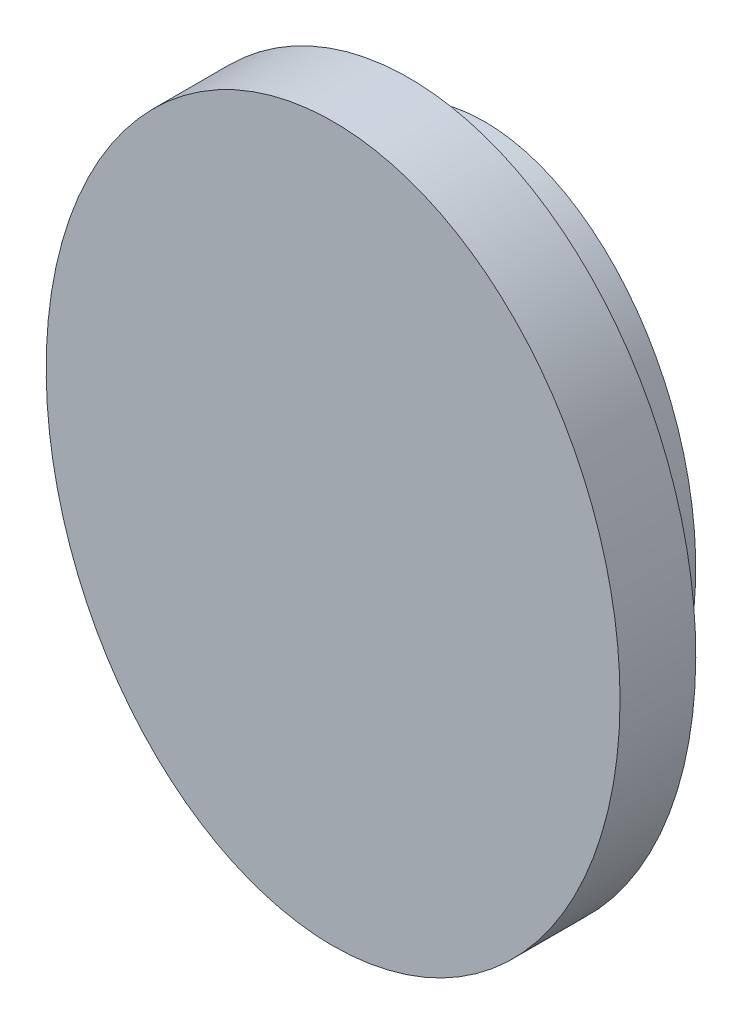
ISO-10303-21;
HEADER;
FILE_DESCRIPTION(('STEP AP214'),'2;1');
FILE_NAME('part.step','',(''),(''),'','','');
FILE_SCHEMA(('AUTOMOTIVE_DESIGN { 1 0 10303 214 1 1 1 1 }'));
ENDSEC;
DATA;
#1=APPLICATION_CONTEXT('core data for automotive mechanical design processes');
#2=APPLICATION_PROTOCOL_DEFINITION('international standard','automotive_design',2000,#1);
#3=PRODUCT_CONTEXT('',#1,'mechanical');
#4=PRODUCT('Part','Part','',(#3));
#5=PRODUCT_RELATED_PRODUCT_CATEGORY('part','',(#4));
#6=PRODUCT_DEFINITION_FORMATION('','',#4);
#7=PRODUCT_DEFINITION_CONTEXT('part definition',#1,'design');
#8=PRODUCT_DEFINITION('design','',#6,#7);
#9=PRODUCT_DEFINITION_SHAPE('','',#8);
#10=(LENGTH_UNIT() NAMED_UNIT(*) SI_UNIT(.MILLI.,.METRE.));
#11=(NAMED_UNIT(*) PLANE_ANGLE_UNIT() SI_UNIT($,.RADIAN.));
#12=(NAMED_UNIT(*) SI_UNIT($,.STERADIAN.) SOLID_ANGLE_UNIT());
#13=UNCERTAINTY_MEASURE_WITH_UNIT(LENGTH_MEASURE(1.E-05),#10,'distance_accuracy_value','');
#14=(GEOMETRIC_REPRESENTATION_CONTEXT(3) GLOBAL_UNCERTAINTY_ASSIGNED_CONTEXT((#13)) GLOBAL_UNIT_ASSIGNED_CONTEXT((#10,
#11,#12)) REPRESENTATION_CONTEXT('',''));
#15=CARTESIAN_POINT('',(0.,0.,0.));
#16=DIRECTION('',(0.,0.,1.));
#17=DIRECTION('',(1.,0.,0.));
#18=AXIS2_PLACEMENT_3D('',#15,#16,#17);
#19=CARTESIAN_POINT('',(1.27,19.4950122346036,-2.54));
#20=CARTESIAN_POINT('',(0.720238367655311,19.4950122346036,-2.54));
#21=CARTESIAN_POINT('',(0.185844426849238,19.408896345784,-2.54));
#22=CARTESIAN_POINT('',(-0.594767976275038,19.1621653072128,-2.54));
#23=CARTESIAN_POINT('',(-0.850648642388675,19.0600105914774,-2.54));
#24=CARTESIAN_POINT('',(-1.34069749980386,18.8247719338621,-2.54));
#25=CARTESIAN_POINT('',(-1.57692884048701,18.6910895864911,-2.54));
#26=CARTESIAN_POINT('',(-2.03324426196175,18.3942274348076,-2.54));
#27=CARTESIAN_POINT('',(-2.25438780143902,18.2299977459865,-2.54));
#28=CARTESIAN_POINT('',(-2.67235496508591,17.8813303880638,-2.54));
#29=CARTESIAN_POINT('',(-2.87014605876249,17.6964670955643,-2.54));
#30=CARTESIAN_POINT('',(-3.24571809162454,17.3079154565766,-2.54));
#31=CARTESIAN_POINT('',(-3.42348656390803,17.1042153815382,-2.54));
#32=CARTESIAN_POINT('',(-3.76041237937625,16.6793063456489,-2.54));
#33=CARTESIAN_POINT('',(-3.92018765386186,16.4571078268279,-2.54));
#34=CARTESIAN_POINT('',(-4.36804480913618,15.7725731833806,-2.54));
#35=CARTESIAN_POINT('',(-4.62308173466788,15.2964008729848,-2.54));
#36=CARTESIAN_POINT('',(-5.05894862807008,14.3102789975543,-2.54));
#37=CARTESIAN_POINT('',(-5.23962424472151,13.8002591754899,-2.54));
#38=CARTESIAN_POINT('',(-5.67539710859768,12.2218354041523,-2.54));
#39=CARTESIAN_POINT('',(-5.81511699391799,11.1504732370603,-2.54));
#40=CARTESIAN_POINT('',(-5.8153986966897,9.51797700454049,-2.54));
#41=CARTESIAN_POINT('',(-5.77943041058958,8.97459896489726,-2.54));
#42=CARTESIAN_POINT('',(-5.63743375750856,7.90655541187376,-2.54));
#43=CARTESIAN_POINT('',(-5.5314555699572,7.37922019805309,-2.54));
#44=CARTESIAN_POINT('',(-5.31698930955057,6.59882626461259,-2.54));
#45=CARTESIAN_POINT('',(-5.23620164112673,6.34047248419364,-2.54));
#46=CARTESIAN_POINT('',(-5.05479543851665,5.82755568533444,-2.54));
#47=CARTESIAN_POINT('',(-4.95405136582652,5.57298285592985,-2.54));
#48=CARTESIAN_POINT('',(-4.62555768200845,4.82811616642929,-2.54));
#49=CARTESIAN_POINT('',(-4.37045852366894,4.35220042737024,-2.54));
#50=CARTESIAN_POINT('',(-3.9271531701489,3.67304076105929,-2.54));
#51=CARTESIAN_POINT('',(-3.76920822458053,3.45247824036495,-2.54));
#52=CARTESIAN_POINT('',(-3.4307203265613,3.02428609827227,-2.54));
#53=CARTESIAN_POINT('',(-3.25086895740379,2.81775995059132,-2.54));
#54=CARTESIAN_POINT('',(-2.68574456872085,2.23213648360285,-2.54));
#55=CARTESIAN_POINT('',(-2.27253363649463,1.88256795693392,-2.54));
#56=CARTESIAN_POINT('',(-1.5852437741058,1.43380472465228,-2.54));
#57=CARTESIAN_POINT('',(-1.34694321130138,1.2986344110307,-2.54));
#58=CARTESIAN_POINT('',(-0.85825873453068,1.06328462999855,-2.54));
#59=CARTESIAN_POINT('',(-0.606817546669746,0.962380873097754,-2.54));
#60=CARTESIAN_POINT('',(-0.0884569815584241,0.797140288425871,-2.54));
#61=CARTESIAN_POINT('',(0.180616401524695,0.732700885205693,-2.54));
#62=CARTESIAN_POINT('',(0.717663263029995,0.647362414997955,-2.54));
#63=CARTESIAN_POINT('',(0.987116161159495,0.625672864704514,-2.54));
#64=CARTESIAN_POINT('',(1.52788616808401,0.62437222018541,-2.54));
#65=CARTESIAN_POINT('',(1.80013942237851,0.64490717705705,-2.54));
#66=CARTESIAN_POINT('',(2.34261623696697,0.729038849752694,-2.54));
#67=CARTESIAN_POINT('',(2.60740948427014,0.791619312471667,-2.54));
#68=CARTESIAN_POINT('',(3.3840656355714,1.03577401539322,-2.54));
#69=CARTESIAN_POINT('',(3.88312150322472,1.27751766426111,-2.54));
#70=CARTESIAN_POINT('',(4.5672461851599,1.72154984226823,-2.54));
#71=CARTESIAN_POINT('',(4.7857900246387,1.88335599829698,-2.54));
#72=CARTESIAN_POINT('',(5.2053802811134,2.23238329814762,-2.54));
#73=CARTESIAN_POINT('',(5.406610057335,2.42006262965064,-2.54));
#74=CARTESIAN_POINT('',(5.97350339007234,3.00604612834402,-2.54));
#75=CARTESIAN_POINT('',(6.30770948692314,3.43073680643004,-2.54));
#76=CARTESIAN_POINT('',(6.90220744904292,4.33765501434297,-2.54));
#77=CARTESIAN_POINT('',(7.1627280928923,4.82270464940451,-2.54));
#78=CARTESIAN_POINT('',(7.60003108729796,5.8123040670762,-2.54));
#79=CARTESIAN_POINT('',(7.77963714715787,6.32064448050377,-2.54));
#80=CARTESIAN_POINT('',(7.99561291839374,7.10168542918369,-2.54));
#81=CARTESIAN_POINT('',(8.05863468096503,7.3651432058307,-2.54));
#82=CARTESIAN_POINT('',(8.16691386571117,7.89821931723203,-2.54));
#83=CARTESIAN_POINT('',(8.21214058234226,8.1681588384446,-2.54));
#84=CARTESIAN_POINT('',(8.31973445432384,8.97579127440154,-2.54));
#85=CARTESIAN_POINT('',(8.35508484407667,9.51500884406632,-2.54));
#86=CARTESIAN_POINT('',(8.35552308051169,10.5949812820161,-2.54));
#87=CARTESIAN_POINT('',(8.32055207296553,11.1362400816912,-2.54));
#88=CARTESIAN_POINT('',(8.17688581850875,12.2183267467024,-2.54));
#89=CARTESIAN_POINT('',(8.06971865652574,12.7481225664913,-2.54));
#90=CARTESIAN_POINT('',(7.78419718138862,13.7850539468139,-2.54));
#91=CARTESIAN_POINT('',(7.60591002766408,14.2922108855046,-2.54));
#92=CARTESIAN_POINT('',(7.1706666136037,15.2814828512229,-2.54));
#93=CARTESIAN_POINT('',(6.91082355847745,15.7673949667501,-2.54));
#94=CARTESIAN_POINT('',(6.31763204741957,16.6759154857402,-2.54));
#95=CARTESIAN_POINT('',(5.98384920219869,17.1017954617753,-2.54));
#96=CARTESIAN_POINT('',(5.41689816651726,17.690034606679,-2.54));
#97=CARTESIAN_POINT('',(5.21575431480187,17.8782776730414,-2.54));
#98=CARTESIAN_POINT('',(4.79774659751364,18.2274093501531,-2.54));
#99=CARTESIAN_POINT('',(4.5801187391635,18.3892751007166,-2.54));
#100=CARTESIAN_POINT('',(4.12619942914884,18.6855217589144,-2.54));
#101=CARTESIAN_POINT('',(3.88992141389905,18.8199224536145,-2.54));
#102=CARTESIAN_POINT('',(3.39630253171159,19.0577057448092,-2.54));
#103=CARTESIAN_POINT('',(3.14129977070706,19.1596688947916,-2.54));
#104=CARTESIAN_POINT('',(2.62373892634532,19.3241069515527,-2.54));
#105=CARTESIAN_POINT('',(2.35980761841118,19.3872775998722,-2.54));
#106=CARTESIAN_POINT('',(1.82092226054045,19.4728559308707,-2.54));
#107=CARTESIAN_POINT('',(1.54488081617235,19.4950122346036,-2.54));
#108=CARTESIAN_POINT('',(1.27,19.4950122346036,-2.54));
#109=B_SPLINE_CURVE_WITH_KNOTS('',3,(#19,#20,#21,#22,#23,#24,#25,#26,#27,#28,#29,#30,#31,#32,
#33,#34,#35,#36,#37,#38,#39,#40,#41,#42,#43,#44,#45,#46,#47,#48,#49,#50,#51,#52,#53,#54,#55,#56,
#57,#58,#59,#60,#61,#62,#63,#64,#65,#66,#67,#68,#69,#70,#71,#72,#73,#74,#75,#76,#77,#78,#79,#80,
#81,#82,#83,#84,#85,#86,#87,#88,#89,#90,#91,#92,#93,#94,#95,#96,#97,#98,#99,#100,#101,#102,#103,
#104,#105,#106,#107,#108),.UNSPECIFIED.,.T.,.F.,(4,2,2,2,2,2,2,2,2,2,2,2,2,2,2,2,2,2,2,2,2,2,2,
2,2,2,2,2,2,2,2,2,2,2,2,2,2,2,2,2,2,2,2,2,4),(0.,0.0312499999999998,0.0468749999999998,
0.0624999999999998,0.0781249999999997,0.0937499999999997,0.109375,0.125,0.15625,
0.187499999999999,0.249999999999999,0.281249999999999,0.312499999999999,0.328124999999999,
0.343749999999999,0.374999999999999,0.390624999999999,0.406249999999999,0.437499999999999,
0.453124999999999,0.468749999999999,0.484374999999999,0.499999999999999,0.515624999999999,
0.531249999999999,0.562499999999999,0.578124999999999,0.593749999999999,0.624999999999999,
0.656249999999999,0.687499999999999,0.703124999999999,0.718749999999999,0.749999999999999,
0.781249999999999,0.812499999999999,0.843749999999999,0.874999999999999,0.90625,0.921875,0.9375,
0.953125,0.96875,0.984375,1.),.UNSPECIFIED.);
#110=DIRECTION('',(0.,0.,1.));
#111=VECTOR('',#110,1.);
#112=SURFACE_OF_LINEAR_EXTRUSION('',#109,#111);
#113=CARTESIAN_POINT('',(1.27,19.4950122346036,-2.54));
#114=CARTESIAN_POINT('',(0.720238367655311,19.4950122346036,-2.54));
#115=CARTESIAN_POINT('',(0.185844426849238,19.408896345784,-2.54));
#116=CARTESIAN_POINT('',(-0.594767976275038,19.1621653072128,-2.54));
#117=CARTESIAN_POINT('',(-0.850648642388675,19.0600105914774,-2.54));
#118=CARTESIAN_POINT('',(-1.34069749980386,18.8247719338621,-2.54));
#119=CARTESIAN_POINT('',(-1.57692884048701,18.6910895864911,-2.54));
#120=CARTESIAN_POINT('',(-2.03324426196175,18.3942274348076,-2.54));
#121=CARTESIAN_POINT('',(-2.25438780143902,18.2299977459865,-2.54));
#122=CARTESIAN_POINT('',(-2.67235496508591,17.8813303880638,-2.54));
#123=CARTESIAN_POINT('',(-2.87014605876249,17.6964670955643,-2.54));
#124=CARTESIAN_POINT('',(-3.24571809162454,17.3079154565766,-2.54));
#125=CARTESIAN_POINT('',(-3.42348656390803,17.1042153815382,-2.54));
#126=CARTESIAN_POINT('',(-3.76041237937625,16.6793063456489,-2.54));
#127=CARTESIAN_POINT('',(-3.92018765386186,16.4571078268279,-2.54));
#128=CARTESIAN_POINT('',(-4.36804480913618,15.7725731833806,-2.54));
#129=CARTESIAN_POINT('',(-4.62308173466788,15.2964008729848,-2.54));
#130=CARTESIAN_POINT('',(-5.05894862807008,14.3102789975543,-2.54));
#131=CARTESIAN_POINT('',(-5.23962424472151,13.8002591754899,-2.54));
#132=CARTESIAN_POINT('',(-5.67539710859768,12.2218354041523,-2.54));
#133=CARTESIAN_POINT('',(-5.81511699391799,11.1504732370603,-2.54));
#134=CARTESIAN_POINT('',(-5.8153986966897,9.51797700454049,-2.54));
#135=CARTESIAN_POINT('',(-5.77943041058958,8.97459896489726,-2.54));
#136=CARTESIAN_POINT('',(-5.63743375750856,7.90655541187376,-2.54));
#137=CARTESIAN_POINT('',(-5.5314555699572,7.37922019805309,-2.54));
#138=CARTESIAN_POINT('',(-5.31698930955057,6.59882626461259,-2.54));
#139=CARTESIAN_POINT('',(-5.23620164112673,6.34047248419364,-2.54));
#140=CARTESIAN_POINT('',(-5.05479543851665,5.82755568533444,-2.54));
#141=CARTESIAN_POINT('',(-4.95405136582652,5.57298285592985,-2.54));
#142=CARTESIAN_POINT('',(-4.62555768200845,4.82811616642929,-2.54));
#143=CARTESIAN_POINT('',(-4.37045852366894,4.35220042737024,-2.54));
#144=CARTESIAN_POINT('',(-3.9271531701489,3.67304076105929,-2.54));
#145=CARTESIAN_POINT('',(-3.76920822458053,3.45247824036495,-2.54));
#146=CARTESIAN_POINT('',(-3.4307203265613,3.02428609827227,-2.54));
#147=CARTESIAN_POINT('',(-3.25086895740379,2.81775995059132,-2.54));
#148=CARTESIAN_POINT('',(-2.68574456872085,2.23213648360285,-2.54));
#149=CARTESIAN_POINT('',(-2.27253363649463,1.88256795693392,-2.54));
#150=CARTESIAN_POINT('',(-1.5852437741058,1.43380472465228,-2.54));
#151=CARTESIAN_POINT('',(-1.34694321130138,1.2986344110307,-2.54));
#152=CARTESIAN_POINT('',(-0.85825873453068,1.06328462999855,-2.54));
#153=CARTESIAN_POINT('',(-0.606817546669746,0.962380873097754,-2.54));
#154=CARTESIAN_POINT('',(-0.0884569815584241,0.797140288425871,-2.54));
#155=CARTESIAN_POINT('',(0.180616401524695,0.732700885205693,-2.54));
#156=CARTESIAN_POINT('',(0.717663263029995,0.647362414997955,-2.54));
#157=CARTESIAN_POINT('',(0.987116161159495,0.625672864704514,-2.54));
#158=CARTESIAN_POINT('',(1.52788616808401,0.62437222018541,-2.54));
#159=CARTESIAN_POINT('',(1.80013942237851,0.64490717705705,-2.54));
#160=CARTESIAN_POINT('',(2.34261623696697,0.729038849752694,-2.54));
#161=CARTESIAN_POINT('',(2.60740948427014,0.791619312471667,-2.54));
#162=CARTESIAN_POINT('',(3.3840656355714,1.03577401539322,-2.54));
#163=CARTESIAN_POINT('',(3.88312150322472,1.27751766426111,-2.54));
#164=CARTESIAN_POINT('',(4.5672461851599,1.72154984226823,-2.54));
#165=CARTESIAN_POINT('',(4.7857900246387,1.88335599829698,-2.54));
#166=CARTESIAN_POINT('',(5.2053802811134,2.23238329814762,-2.54));
#167=CARTESIAN_POINT('',(5.406610057335,2.42006262965064,-2.54));
#168=CARTESIAN_POINT('',(5.97350339007234,3.00604612834402,-2.54));
#169=CARTESIAN_POINT('',(6.30770948692314,3.43073680643004,-2.54));
#170=CARTESIAN_POINT('',(6.90220744904292,4.33765501434297,-2.54));
#171=CARTESIAN_POINT('',(7.1627280928923,4.82270464940451,-2.54));
#172=CARTESIAN_POINT('',(7.60003108729796,5.8123040670762,-2.54));
#173=CARTESIAN_POINT('',(7.77963714715787,6.32064448050377,-2.54));
#174=CARTESIAN_POINT('',(7.99561291839374,7.10168542918369,-2.54));
#175=CARTESIAN_POINT('',(8.05863468096503,7.3651432058307,-2.54));
#176=CARTESIAN_POINT('',(8.16691386571117,7.89821931723203,-2.54));
#177=CARTESIAN_POINT('',(8.21214058234226,8.1681588384446,-2.54));
#178=CARTESIAN_POINT('',(8.31973445432384,8.97579127440154,-2.54));
#179=CARTESIAN_POINT('',(8.35508484407667,9.51500884406632,-2.54));
#180=CARTESIAN_POINT('',(8.35552308051169,10.5949812820161,-2.54));
#181=CARTESIAN_POINT('',(8.32055207296553,11.1362400816912,-2.54));
#182=CARTESIAN_POINT('',(8.17688581850875,12.2183267467024,-2.54));
#183=CARTESIAN_POINT('',(8.06971865652574,12.7481225664913,-2.54));
#184=CARTESIAN_POINT('',(7.78419718138862,13.7850539468139,-2.54));
#185=CARTESIAN_POINT('',(7.60591002766408,14.2922108855046,-2.54));
#186=CARTESIAN_POINT('',(7.1706666136037,15.2814828512229,-2.54));
#187=CARTESIAN_POINT('',(6.91082355847745,15.7673949667501,-2.54));
#188=CARTESIAN_POINT('',(6.31763204741957,16.6759154857402,-2.54));
#189=CARTESIAN_POINT('',(5.98384920219869,17.1017954617753,-2.54));
#190=CARTESIAN_POINT('',(5.41689816651726,17.690034606679,-2.54));
#191=CARTESIAN_POINT('',(5.21575431480187,17.8782776730414,-2.54));
#192=CARTESIAN_POINT('',(4.79774659751364,18.2274093501531,-2.54));
#193=CARTESIAN_POINT('',(4.5801187391635,18.3892751007166,-2.54));
#194=CARTESIAN_POINT('',(4.12619942914884,18.6855217589144,-2.54));
#195=CARTESIAN_POINT('',(3.88992141389905,18.8199224536145,-2.54));
#196=CARTESIAN_POINT('',(3.39630253171159,19.0577057448092,-2.54));
#197=CARTESIAN_POINT('',(3.14129977070706,19.1596688947916,-2.54));
#198=CARTESIAN_POINT('',(2.62373892634532,19.3241069515527,-2.54));
#199=CARTESIAN_POINT('',(2.35980761841118,19.3872775998722,-2.54));
#200=CARTESIAN_POINT('',(1.82092226054045,19.4728559308707,-2.54));
#201=CARTESIAN_POINT('',(1.54488081617235,19.4950122346036,-2.54));
#202=CARTESIAN_POINT('',(1.27,19.4950122346036,-2.54));
#203=B_SPLINE_CURVE_WITH_KNOTS('',3,(#113,#114,#115,#116,#117,#118,#119,#120,#121,#122,#123,
#124,#125,#126,#127,#128,#129,#130,#131,#132,#133,#134,#135,#136,#137,#138,#139,#140,#141,#142,
#143,#144,#145,#146,#147,#148,#149,#150,#151,#152,#153,#154,#155,#156,#157,#158,#159,#160,#161,
#162,#163,#164,#165,#166,#167,#168,#169,#170,#171,#172,#173,#174,#175,#176,#177,#178,#179,#180,
#181,#182,#183,#184,#185,#186,#187,#188,#189,#190,#191,#192,#193,#194,#195,#196,#197,#198,#199,
#200,#201,#202),.UNSPECIFIED.,.T.,.F.,(4,2,2,2,2,2,2,2,2,2,2,2,2,2,2,2,2,2,2,2,2,2,2,2,2,2,2,2,
2,2,2,2,2,2,2,2,2,2,2,2,2,2,2,2,4),(0.,0.0312499999999998,0.0468749999999998,0.0624999999999998,
0.0781249999999997,0.0937499999999997,0.109375,0.125,0.15625,0.187499999999999,
0.249999999999999,0.281249999999999,0.312499999999999,0.328124999999999,0.343749999999999,
0.374999999999999,0.390624999999999,0.406249999999999,0.437499999999999,0.453124999999999,
0.468749999999999,0.484374999999999,0.499999999999999,0.515624999999999,0.531249999999999,
0.562499999999999,0.578124999999999,0.593749999999999,0.624999999999999,0.656249999999999,
0.687499999999999,0.703124999999999,0.718749999999999,0.749999999999999,0.781249999999999,
0.812499999999999,0.843749999999999,0.874999999999999,0.90625,0.921875,0.9375,0.953125,0.96875,
0.984375,1.),.UNSPECIFIED.);
#204=CARTESIAN_POINT('',(1.27,19.4950122346036,-2.54));
#205=VERTEX_POINT('',#204);
#206=EDGE_CURVE('E10',#205,#205,#203,.T.);
#207=ORIENTED_EDGE('',*,*,#206,.T.);
#208=EDGE_LOOP('',(#207));
#209=FACE_BOUND('',#208,.T.);
#210=CARTESIAN_POINT('',(1.27,19.4950122346036,0.));
#211=CARTESIAN_POINT('',(1.54488081617235,19.4950122346036,0.));
#212=CARTESIAN_POINT('',(1.82092226054045,19.4728559308707,0.));
#213=CARTESIAN_POINT('',(2.35980761841118,19.3872775998722,0.));
#214=CARTESIAN_POINT('',(2.62373892634532,19.3241069515527,0.));
#215=CARTESIAN_POINT('',(3.14129977070706,19.1596688947916,0.));
#216=CARTESIAN_POINT('',(3.39630253171159,19.0577057448092,0.));
#217=CARTESIAN_POINT('',(3.88992141389905,18.8199224536145,0.));
#218=CARTESIAN_POINT('',(4.12619942914884,18.6855217589144,0.));
#219=CARTESIAN_POINT('',(4.5801187391635,18.3892751007166,0.));
#220=CARTESIAN_POINT('',(4.79774659751364,18.2274093501531,0.));
#221=CARTESIAN_POINT('',(5.21575431480187,17.8782776730414,0.));
#222=CARTESIAN_POINT('',(5.41689816651726,17.690034606679,0.));
#223=CARTESIAN_POINT('',(5.98384920219869,17.1017954617753,0.));
#224=CARTESIAN_POINT('',(6.31763204741957,16.6759154857402,0.));
#225=CARTESIAN_POINT('',(6.91082355847745,15.7673949667501,0.));
#226=CARTESIAN_POINT('',(7.1706666136037,15.2814828512229,0.));
#227=CARTESIAN_POINT('',(7.60591002766408,14.2922108855046,0.));
#228=CARTESIAN_POINT('',(7.78419718138862,13.7850539468139,0.));
#229=CARTESIAN_POINT('',(8.06971865652574,12.7481225664913,0.));
#230=CARTESIAN_POINT('',(8.17688581850875,12.2183267467024,0.));
#231=CARTESIAN_POINT('',(8.32055207296553,11.1362400816912,0.));
#232=CARTESIAN_POINT('',(8.35552308051169,10.5949812820161,0.));
#233=CARTESIAN_POINT('',(8.35508484407667,9.51500884406632,0.));
#234=CARTESIAN_POINT('',(8.31973445432384,8.97579127440154,0.));
#235=CARTESIAN_POINT('',(8.21214058234226,8.1681588384446,0.));
#236=CARTESIAN_POINT('',(8.16691386571117,7.89821931723203,0.));
#237=CARTESIAN_POINT('',(8.05863468096503,7.3651432058307,0.));
#238=CARTESIAN_POINT('',(7.99561291839374,7.10168542918369,0.));
#239=CARTESIAN_POINT('',(7.77963714715787,6.32064448050377,0.));
#240=CARTESIAN_POINT('',(7.60003108729796,5.8123040670762,0.));
#241=CARTESIAN_POINT('',(7.1627280928923,4.82270464940451,0.));
#242=CARTESIAN_POINT('',(6.90220744904292,4.33765501434297,0.));
#243=CARTESIAN_POINT('',(6.30770948692314,3.43073680643004,0.));
#244=CARTESIAN_POINT('',(5.97350339007234,3.00604612834402,0.));
#245=CARTESIAN_POINT('',(5.406610057335,2.42006262965064,0.));
#246=CARTESIAN_POINT('',(5.2053802811134,2.23238329814762,0.));
#247=CARTESIAN_POINT('',(4.7857900246387,1.88335599829698,0.));
#248=CARTESIAN_POINT('',(4.5672461851599,1.72154984226823,0.));
#249=CARTESIAN_POINT('',(3.88312150322472,1.27751766426111,0.));
#250=CARTESIAN_POINT('',(3.3840656355714,1.03577401539322,0.));
#251=CARTESIAN_POINT('',(2.60740948427014,0.791619312471667,0.));
#252=CARTESIAN_POINT('',(2.34261623696697,0.729038849752694,0.));
#253=CARTESIAN_POINT('',(1.80013942237851,0.64490717705705,0.));
#254=CARTESIAN_POINT('',(1.52788616808401,0.62437222018541,0.));
#255=CARTESIAN_POINT('',(0.987116161159495,0.625672864704514,0.));
#256=CARTESIAN_POINT('',(0.717663263029995,0.647362414997955,0.));
#257=CARTESIAN_POINT('',(0.180616401524695,0.732700885205693,0.));
#258=CARTESIAN_POINT('',(-0.0884569815584241,0.797140288425871,0.));
#259=CARTESIAN_POINT('',(-0.606817546669746,0.962380873097754,0.));
#260=CARTESIAN_POINT('',(-0.85825873453068,1.06328462999855,0.));
#261=CARTESIAN_POINT('',(-1.34694321130138,1.2986344110307,0.));
#262=CARTESIAN_POINT('',(-1.5852437741058,1.43380472465228,0.));
#263=CARTESIAN_POINT('',(-2.27253363649463,1.88256795693392,0.));
#264=CARTESIAN_POINT('',(-2.68574456872085,2.23213648360285,0.));
#265=CARTESIAN_POINT('',(-3.25086895740379,2.81775995059132,0.));
#266=CARTESIAN_POINT('',(-3.4307203265613,3.02428609827227,0.));
#267=CARTESIAN_POINT('',(-3.76920822458053,3.45247824036495,0.));
#268=CARTESIAN_POINT('',(-3.9271531701489,3.67304076105929,0.));
#269=CARTESIAN_POINT('',(-4.37045852366894,4.35220042737024,0.));
#270=CARTESIAN_POINT('',(-4.62555768200845,4.82811616642929,0.));
#271=CARTESIAN_POINT('',(-4.95405136582652,5.57298285592985,0.));
#272=CARTESIAN_POINT('',(-5.05479543851665,5.82755568533444,0.));
#273=CARTESIAN_POINT('',(-5.23620164112673,6.34047248419364,0.));
#274=CARTESIAN_POINT('',(-5.31698930955057,6.59882626461259,0.));
#275=CARTESIAN_POINT('',(-5.5314555699572,7.37922019805309,0.));
#276=CARTESIAN_POINT('',(-5.63743375750856,7.90655541187376,0.));
#277=CARTESIAN_POINT('',(-5.77943041058958,8.97459896489726,0.));
#278=CARTESIAN_POINT('',(-5.8153986966897,9.51797700454049,0.));
#279=CARTESIAN_POINT('',(-5.81511699391799,11.1504732370603,0.));
#280=CARTESIAN_POINT('',(-5.67539710859768,12.2218354041523,0.));
#281=CARTESIAN_POINT('',(-5.23962424472151,13.8002591754899,0.));
#282=CARTESIAN_POINT('',(-5.05894862807008,14.3102789975543,0.));
#283=CARTESIAN_POINT('',(-4.62308173466788,15.2964008729848,0.));
#284=CARTESIAN_POINT('',(-4.36804480913618,15.7725731833806,0.));
#285=CARTESIAN_POINT('',(-3.92018765386186,16.4571078268279,0.));
#286=CARTESIAN_POINT('',(-3.76041237937625,16.6793063456489,0.));
#287=CARTESIAN_POINT('',(-3.42348656390803,17.1042153815382,0.));
#288=CARTESIAN_POINT('',(-3.24571809162454,17.3079154565766,0.));
#289=CARTESIAN_POINT('',(-2.87014605876249,17.6964670955643,0.));
#290=CARTESIAN_POINT('',(-2.67235496508591,17.8813303880638,0.));
#291=CARTESIAN_POINT('',(-2.25438780143902,18.2299977459865,0.));
#292=CARTESIAN_POINT('',(-2.03324426196175,18.3942274348076,0.));
#293=CARTESIAN_POINT('',(-1.57692884048701,18.6910895864911,0.));
#294=CARTESIAN_POINT('',(-1.34069749980386,18.8247719338621,0.));
#295=CARTESIAN_POINT('',(-0.850648642388675,19.0600105914774,0.));
#296=CARTESIAN_POINT('',(-0.594767976275038,19.1621653072128,0.));
#297=CARTESIAN_POINT('',(0.185844426849238,19.408896345784,0.));
#298=CARTESIAN_POINT('',(0.720238367655311,19.4950122346036,0.));
#299=CARTESIAN_POINT('',(1.27,19.4950122346036,0.));
#300=B_SPLINE_CURVE_WITH_KNOTS('',3,(#210,#211,#212,#213,#214,#215,#216,#217,#218,#219,#220,
#221,#222,#223,#224,#225,#226,#227,#228,#229,#230,#231,#232,#233,#234,#235,#236,#237,#238,#239,
#240,#241,#242,#243,#244,#245,#246,#247,#248,#249,#250,#251,#252,#253,#254,#255,#256,#257,#258,
#259,#260,#261,#262,#263,#264,#265,#266,#267,#268,#269,#270,#271,#272,#273,#274,#275,#276,#277,
#278,#279,#280,#281,#282,#283,#284,#285,#286,#287,#288,#289,#290,#291,#292,#293,#294,#295,#296,
#297,#298,#299),.UNSPECIFIED.,.T.,.F.,(4,2,2,2,2,2,2,2,2,2,2,2,2,2,2,2,2,2,2,2,2,2,2,2,2,2,2,2,
2,2,2,2,2,2,2,2,2,2,2,2,2,2,2,2,4),(0.,0.0156250000000001,0.0312500000000002,0.0468750000000002,
0.0625000000000002,0.0781250000000003,0.0937500000000003,0.125000000000001,0.156250000000001,
0.187500000000001,0.218750000000001,0.250000000000001,0.281250000000001,0.296875000000001,
0.312500000000001,0.343750000000001,0.375000000000001,0.406250000000001,0.421875000000001,
0.437500000000001,0.468750000000001,0.484375000000001,0.500000000000001,0.515625000000001,
0.531250000000001,0.546875000000001,0.562500000000001,0.593750000000001,0.609375000000001,
0.625000000000001,0.656250000000001,0.671875000000001,0.687500000000001,0.718750000000001,
0.750000000000001,0.812500000000001,0.84375,0.875,0.890625,0.90625,0.921875,0.9375,0.953125,
0.96875,1.),.UNSPECIFIED.);
#301=CARTESIAN_POINT('',(1.27,19.4950122346036,0.));
#302=VERTEX_POINT('',#301);
#303=EDGE_CURVE('E49',#302,#302,#300,.F.);
#304=ORIENTED_EDGE('',*,*,#303,.F.);
#305=EDGE_LOOP('',(#304));
#306=FACE_BOUND('',#305,.T.);
#307=ADVANCED_FACE('F39',(#209,#306),#112,.T.);
#308=CARTESIAN_POINT('',(1.2575011646218,0.625022542444962,-2.54));
#309=DIRECTION('',(0.,0.,-1.));
#310=DIRECTION('',(-1.,0.,0.));
#311=AXIS2_PLACEMENT_3D('',#308,#309,#310);
#312=PLANE('',#311);
#313=ORIENTED_EDGE('',*,*,#206,.F.);
#314=EDGE_LOOP('',(#313));
#315=FACE_BOUND('',#314,.T.);
#316=ADVANCED_FACE('F75',(#315),#312,.T.);
#317=CARTESIAN_POINT('',(1.27,10.0600098730693,0.));
#318=DIRECTION('',(0.,0.,1.));
#319=DIRECTION('',(1.,0.,0.));
#320=AXIS2_PLACEMENT_3D('',#317,#318,#319);
#321=PLANE('',#320);
#322=CARTESIAN_POINT('',(1.27,10.0600098730693,0.));
#323=DIRECTION('',(0.,0.,1.));
#324=DIRECTION('',(0.,-1.,0.));
#325=AXIS2_PLACEMENT_3D('',#322,#323,#324);
#326=ELLIPSE('',#325,11.9750023615343,9.62530497976104);
#327=CARTESIAN_POINT('',(1.27,-1.91499248846504,0.));
#328=VERTEX_POINT('',#327);
#329=EDGE_CURVE('E59',#328,#328,#326,.T.);
#330=ORIENTED_EDGE('',*,*,#329,.F.);
#331=EDGE_LOOP('',(#330));
#332=FACE_BOUND('',#331,.T.);
#333=ORIENTED_EDGE('',*,*,#303,.T.);
#334=EDGE_LOOP('',(#333));
#335=FACE_BOUND('',#334,.T.);
#336=ADVANCED_FACE('F71',(#332,#335),#321,.F.);
#337=CARTESIAN_POINT('',(1.27,10.0600098730693,2.54));
#338=DIRECTION('',(0.,0.,1.));
#339=DIRECTION('',(0.,-1.,0.));
#340=AXIS2_PLACEMENT_3D('',#337,#338,#339);
#341=ELLIPSE('',#340,11.9750023615343,9.62530497976104);
#342=DIRECTION('',(0.,0.,-1.));
#343=VECTOR('',#342,1.);
#344=SURFACE_OF_LINEAR_EXTRUSION('',#341,#343);
#345=CARTESIAN_POINT('',(1.27,-1.91499248846504,2.54));
#346=VERTEX_POINT('',#345);
#347=EDGE_CURVE('E54',#346,#346,#341,.T.);
#348=ORIENTED_EDGE('',*,*,#347,.F.);
#349=EDGE_LOOP('',(#348));
#350=FACE_BOUND('',#349,.T.);
#351=ORIENTED_EDGE('',*,*,#329,.T.);
#352=EDGE_LOOP('',(#351));
#353=FACE_BOUND('',#352,.T.);
#354=ADVANCED_FACE('F67',(#350,#353),#344,.F.);
#355=CARTESIAN_POINT('',(1.27,10.0600098730693,2.54));
#356=DIRECTION('',(0.,0.,1.));
#357=DIRECTION('',(1.,0.,0.));
#358=AXIS2_PLACEMENT_3D('',#355,#356,#357);
#359=PLANE('',#358);
#360=ORIENTED_EDGE('',*,*,#347,.T.);
#361=EDGE_LOOP('',(#360));
#362=FACE_BOUND('',#361,.T.);
#363=ADVANCED_FACE('F70',(#362),#359,.T.);
#364=CLOSED_SHELL('',(#307,#316,#336,#354,#363));
#365=MANIFOLD_SOLID_BREP('B2',#364);
#366=ADVANCED_BREP_SHAPE_REPRESENTATION('',(#18,#365),#14);
#367=SHAPE_DEFINITION_REPRESENTATION(#9,#366);
ENDSEC;
END-ISO-10303-21;
